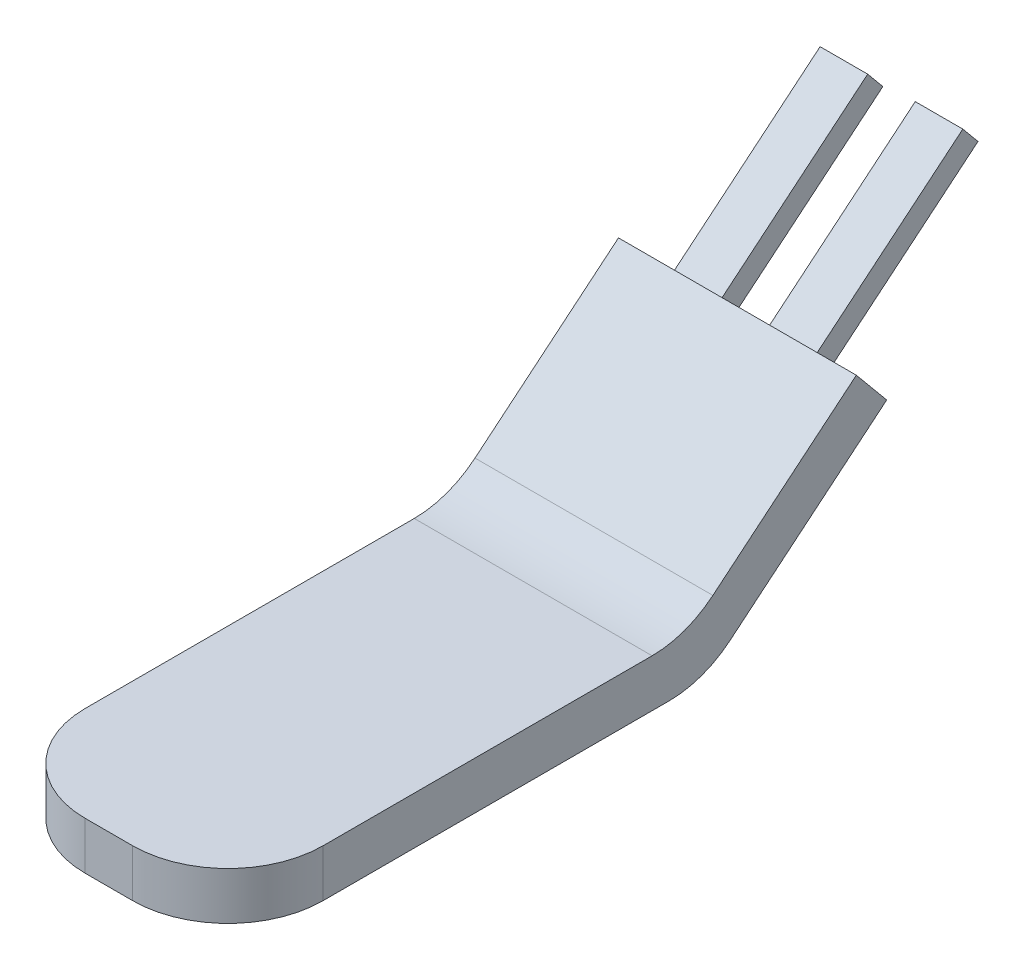
ISO-10303-21;
HEADER;
FILE_DESCRIPTION(('STEP AP214'),'2;1');
FILE_NAME('part.step','',(''),(''),'','','');
FILE_SCHEMA(('AUTOMOTIVE_DESIGN { 1 0 10303 214 1 1 1 1 }'));
ENDSEC;
DATA;
#1=APPLICATION_CONTEXT('core data for automotive mechanical design processes');
#2=APPLICATION_PROTOCOL_DEFINITION('international standard','automotive_design',2000,#1);
#3=PRODUCT_CONTEXT('',#1,'mechanical');
#4=PRODUCT('Part','Part','',(#3));
#5=PRODUCT_RELATED_PRODUCT_CATEGORY('part','',(#4));
#6=PRODUCT_DEFINITION_FORMATION('','',#4);
#7=PRODUCT_DEFINITION_CONTEXT('part definition',#1,'design');
#8=PRODUCT_DEFINITION('design','',#6,#7);
#9=PRODUCT_DEFINITION_SHAPE('','',#8);
#10=(LENGTH_UNIT() NAMED_UNIT(*) SI_UNIT(.MILLI.,.METRE.));
#11=(NAMED_UNIT(*) PLANE_ANGLE_UNIT() SI_UNIT($,.RADIAN.));
#12=(NAMED_UNIT(*) SI_UNIT($,.STERADIAN.) SOLID_ANGLE_UNIT());
#13=UNCERTAINTY_MEASURE_WITH_UNIT(LENGTH_MEASURE(1.E-05),#10,'distance_accuracy_value','');
#14=(GEOMETRIC_REPRESENTATION_CONTEXT(3) GLOBAL_UNCERTAINTY_ASSIGNED_CONTEXT((#13)) GLOBAL_UNIT_ASSIGNED_CONTEXT((#10,
#11,#12)) REPRESENTATION_CONTEXT('',''));
#15=CARTESIAN_POINT('',(0.,0.,0.));
#16=DIRECTION('',(0.,0.,1.));
#17=DIRECTION('',(1.,0.,0.));
#18=AXIS2_PLACEMENT_3D('',#15,#16,#17);
#19=CARTESIAN_POINT('',(2.5,1.59603458728937,-6.92423324890099));
#20=DIRECTION('',(0.,-0.63841383491575,0.769693299560393));
#21=DIRECTION('',(0.,-0.769693299560394,-0.63841383491575));
#22=AXIS2_PLACEMENT_3D('',#19,#20,#21);
#23=PLANE('',#22);
#24=DIRECTION('',(0.,-0.769693299560392,-0.638413834915752));
#25=VECTOR('',#24,1.);
#26=CARTESIAN_POINT('',(2.,1.69224624973443,-6.84443151953653));
#27=LINE('',#26,#25);
#28=CARTESIAN_POINT('',(2.,1.88466957462453,-6.68482806080759));
#29=VERTEX_POINT('',#28);
#30=CARTESIAN_POINT('',(2.,1.69224624973442,-6.84443151953652));
#31=VERTEX_POINT('',#30);
#32=EDGE_CURVE('E178',#29,#31,#27,.T.);
#33=ORIENTED_EDGE('',*,*,#32,.F.);
#34=DIRECTION('',(1.,0.,0.));
#35=VECTOR('',#34,1.);
#36=CARTESIAN_POINT('',(1.5,1.88466957462453,-6.68482806080759));
#37=LINE('',#36,#35);
#38=CARTESIAN_POINT('',(1.5,1.88466957462452,-6.68482806080758));
#39=VERTEX_POINT('',#38);
#40=EDGE_CURVE('E191',#39,#29,#37,.T.);
#41=ORIENTED_EDGE('',*,*,#40,.F.);
#42=DIRECTION('',(0.,0.769693299560392,0.638413834915752));
#43=VECTOR('',#42,1.);
#44=CARTESIAN_POINT('',(1.5,1.69224624973443,-6.84443151953653));
#45=LINE('',#44,#43);
#46=CARTESIAN_POINT('',(1.5,1.69224624973443,-6.84443151953651));
#47=VERTEX_POINT('',#46);
#48=EDGE_CURVE('E200',#47,#39,#45,.T.);
#49=ORIENTED_EDGE('',*,*,#48,.F.);
#50=DIRECTION('',(-1.,0.,0.));
#51=VECTOR('',#50,1.);
#52=CARTESIAN_POINT('',(1.5,1.69224624973443,-6.84443151953653));
#53=LINE('',#52,#51);
#54=EDGE_CURVE('E181',#31,#47,#53,.T.);
#55=ORIENTED_EDGE('',*,*,#54,.F.);
#56=EDGE_LOOP('',(#33,#41,#49,#55));
#57=FACE_BOUND('',#56,.T.);
#58=DIRECTION('',(0.,0.769693299560393,0.63841383491575));
#59=VECTOR('',#58,1.);
#60=CARTESIAN_POINT('',(0.,1.59603458728937,-6.92423324890099));
#61=LINE('',#60,#59);
#62=CARTESIAN_POINT('',(0.,1.59603458728937,-6.92423324890099));
#63=VERTEX_POINT('',#62);
#64=CARTESIAN_POINT('',(0.,1.98088123706957,-6.60502633144311));
#65=VERTEX_POINT('',#64);
#66=EDGE_CURVE('E235',#63,#65,#61,.T.);
#67=ORIENTED_EDGE('',*,*,#66,.T.);
#68=DIRECTION('',(-1.,0.,0.));
#69=VECTOR('',#68,1.);
#70=CARTESIAN_POINT('',(2.5,1.98088123706957,-6.60502633144311));
#71=LINE('',#70,#69);
#72=CARTESIAN_POINT('',(2.5,1.98088123706957,-6.60502633144311));
#73=VERTEX_POINT('',#72);
#74=EDGE_CURVE('E243',#73,#65,#71,.T.);
#75=ORIENTED_EDGE('',*,*,#74,.F.);
#76=DIRECTION('',(0.,0.769693299560393,0.63841383491575));
#77=VECTOR('',#76,1.);
#78=CARTESIAN_POINT('',(2.5,1.59603458728937,-6.92423324890099));
#79=LINE('',#78,#77);
#80=CARTESIAN_POINT('',(2.5,1.59603458728937,-6.92423324890099));
#81=VERTEX_POINT('',#80);
#82=EDGE_CURVE('E223',#81,#73,#79,.T.);
#83=ORIENTED_EDGE('',*,*,#82,.F.);
#84=DIRECTION('',(-1.,0.,0.));
#85=VECTOR('',#84,1.);
#86=CARTESIAN_POINT('',(2.5,1.59603458728937,-6.92423324890099));
#87=LINE('',#86,#85);
#88=EDGE_CURVE('E246',#81,#63,#87,.T.);
#89=ORIENTED_EDGE('',*,*,#88,.T.);
#90=EDGE_LOOP('',(#67,#75,#83,#89));
#91=FACE_BOUND('',#90,.T.);
#92=DIRECTION('',(0.,0.769693299560392,0.638413834915751));
#93=VECTOR('',#92,1.);
#94=CARTESIAN_POINT('',(0.500000000000001,1.69224624973443,-6.84443151953653));
#95=LINE('',#94,#93);
#96=CARTESIAN_POINT('',(0.500000000000001,1.69224624973443,-6.84443151953653));
#97=VERTEX_POINT('',#96);
#98=CARTESIAN_POINT('',(0.500000000000001,1.88466957462452,-6.68482806080758));
#99=VERTEX_POINT('',#98);
#100=EDGE_CURVE('E177',#97,#99,#95,.T.);
#101=ORIENTED_EDGE('',*,*,#100,.F.);
#102=DIRECTION('',(-1.,0.,0.));
#103=VECTOR('',#102,1.);
#104=CARTESIAN_POINT('',(1.,1.69224624973443,-6.84443151953653));
#105=LINE('',#104,#103);
#106=CARTESIAN_POINT('',(1.,1.69224624973442,-6.84443151953652));
#107=VERTEX_POINT('',#106);
#108=EDGE_CURVE('E174',#107,#97,#105,.T.);
#109=ORIENTED_EDGE('',*,*,#108,.F.);
#110=DIRECTION('',(0.,-0.769693299560393,-0.638413834915751));
#111=VECTOR('',#110,1.);
#112=CARTESIAN_POINT('',(1.,1.69224624973443,-6.84443151953653));
#113=LINE('',#112,#111);
#114=CARTESIAN_POINT('',(1.,1.88466957462451,-6.68482806080759));
#115=VERTEX_POINT('',#114);
#116=EDGE_CURVE('E53',#115,#107,#113,.T.);
#117=ORIENTED_EDGE('',*,*,#116,.F.);
#118=DIRECTION('',(1.,0.,0.));
#119=VECTOR('',#118,1.);
#120=CARTESIAN_POINT('',(1.,1.88466957462453,-6.68482806080759));
#121=LINE('',#120,#119);
#122=EDGE_CURVE('E48',#99,#115,#121,.T.);
#123=ORIENTED_EDGE('',*,*,#122,.F.);
#124=EDGE_LOOP('',(#101,#109,#117,#123));
#125=FACE_BOUND('',#124,.T.);
#126=ADVANCED_FACE('F33',(#57,#91,#125),#23,.F.);
#127=CARTESIAN_POINT('',(2.5,0.499999999999999,0.));
#128=DIRECTION('',(0.,0.,-1.));
#129=DIRECTION('',(0.,1.,0.));
#130=AXIS2_PLACEMENT_3D('',#127,#128,#129);
#131=PLANE('',#130);
#132=DIRECTION('',(-1.,0.,0.));
#133=VECTOR('',#132,1.);
#134=CARTESIAN_POINT('',(2.5,0.,0.));
#135=LINE('',#134,#133);
#136=CARTESIAN_POINT('',(1.5,0.,0.));
#137=VERTEX_POINT('',#136);
#138=CARTESIAN_POINT('',(1.,0.,0.));
#139=VERTEX_POINT('',#138);
#140=EDGE_CURVE('E249',#137,#139,#135,.T.);
#141=ORIENTED_EDGE('',*,*,#140,.F.);
#142=DIRECTION('',(0.,-1.,0.));
#143=VECTOR('',#142,1.);
#144=CARTESIAN_POINT('',(1.5,0.499999999999999,0.));
#145=LINE('',#144,#143);
#146=CARTESIAN_POINT('',(1.5,0.499999999999999,0.));
#147=VERTEX_POINT('',#146);
#148=EDGE_CURVE('E262',#137,#147,#145,.F.);
#149=ORIENTED_EDGE('',*,*,#148,.T.);
#150=DIRECTION('',(-1.,0.,0.));
#151=VECTOR('',#150,1.);
#152=CARTESIAN_POINT('',(2.5,0.499999999999999,0.));
#153=LINE('',#152,#151);
#154=CARTESIAN_POINT('',(1.,0.499999999999999,0.));
#155=VERTEX_POINT('',#154);
#156=EDGE_CURVE('E230',#147,#155,#153,.T.);
#157=ORIENTED_EDGE('',*,*,#156,.T.);
#158=DIRECTION('',(0.,-1.,0.));
#159=VECTOR('',#158,1.);
#160=CARTESIAN_POINT('',(1.,0.499999999999999,0.));
#161=LINE('',#160,#159);
#162=EDGE_CURVE('E259',#155,#139,#161,.T.);
#163=ORIENTED_EDGE('',*,*,#162,.T.);
#164=EDGE_LOOP('',(#141,#149,#157,#163));
#165=FACE_BOUND('',#164,.T.);
#166=ADVANCED_FACE('F332',(#165),#131,.F.);
#167=CARTESIAN_POINT('',(2.5,0.,0.));
#168=DIRECTION('',(0.,1.,0.));
#169=DIRECTION('',(0.,0.,1.));
#170=AXIS2_PLACEMENT_3D('',#167,#168,#169);
#171=PLANE('',#170);
#172=DIRECTION('',(0.,0.,-1.));
#173=VECTOR('',#172,1.);
#174=CARTESIAN_POINT('',(0.,0.,0.));
#175=LINE('',#174,#173);
#176=CARTESIAN_POINT('',(0.,0.,-1.));
#177=VERTEX_POINT('',#176);
#178=CARTESIAN_POINT('',(0.,0.,-4.63925170814947));
#179=VERTEX_POINT('',#178);
#180=EDGE_CURVE('E216',#177,#179,#175,.T.);
#181=ORIENTED_EDGE('',*,*,#180,.T.);
#182=DIRECTION('',(-1.,0.,0.));
#183=VECTOR('',#182,1.);
#184=CARTESIAN_POINT('',(2.5,0.,-4.63925170814947));
#185=LINE('',#184,#183);
#186=CARTESIAN_POINT('',(2.5,0.,-4.63925170814947));
#187=VERTEX_POINT('',#186);
#188=EDGE_CURVE('E277',#179,#187,#185,.F.);
#189=ORIENTED_EDGE('',*,*,#188,.T.);
#190=DIRECTION('',(0.,0.,-1.));
#191=VECTOR('',#190,1.);
#192=CARTESIAN_POINT('',(2.5,0.,0.));
#193=LINE('',#192,#191);
#194=CARTESIAN_POINT('',(2.5,0.,-1.));
#195=VERTEX_POINT('',#194);
#196=EDGE_CURVE('E217',#195,#187,#193,.T.);
#197=ORIENTED_EDGE('',*,*,#196,.F.);
#198=CARTESIAN_POINT('',(1.5,0.,-1.));
#199=DIRECTION('',(0.,1.,0.));
#200=DIRECTION('',(0.,0.,1.));
#201=AXIS2_PLACEMENT_3D('',#198,#199,#200);
#202=CIRCLE('',#201,1.);
#203=EDGE_CURVE('E257',#195,#137,#202,.F.);
#204=ORIENTED_EDGE('',*,*,#203,.T.);
#205=ORIENTED_EDGE('',*,*,#140,.T.);
#206=CARTESIAN_POINT('',(1.,0.,-1.));
#207=DIRECTION('',(0.,1.,0.));
#208=DIRECTION('',(0.,0.,1.));
#209=AXIS2_PLACEMENT_3D('',#206,#207,#208);
#210=CIRCLE('',#209,1.);
#211=EDGE_CURVE('E255',#139,#177,#210,.F.);
#212=ORIENTED_EDGE('',*,*,#211,.T.);
#213=EDGE_LOOP('',(#181,#189,#197,#204,#205,#212));
#214=FACE_BOUND('',#213,.T.);
#215=ADVANCED_FACE('F313',(#214),#171,.F.);
#216=CARTESIAN_POINT('',(2.5,0.,-5.));
#217=DIRECTION('',(0.,0.769693299560395,0.638413834915748));
#218=DIRECTION('',(0.,-0.638413834915748,0.769693299560395));
#219=AXIS2_PLACEMENT_3D('',#216,#217,#218);
#220=PLANE('',#219);
#221=DIRECTION('',(0.,0.638413834915748,-0.769693299560395));
#222=VECTOR('',#221,1.);
#223=CARTESIAN_POINT('',(2.5,0.,-5.));
#224=LINE('',#223,#222);
#225=CARTESIAN_POINT('',(2.5,0.230306700439605,-5.27766554306521));
#226=VERTEX_POINT('',#225);
#227=EDGE_CURVE('E220',#226,#81,#224,.T.);
#228=ORIENTED_EDGE('',*,*,#227,.F.);
#229=DIRECTION('',(-1.,0.,0.));
#230=VECTOR('',#229,1.);
#231=CARTESIAN_POINT('',(2.5,0.230306700439605,-5.27766554306521));
#232=LINE('',#231,#230);
#233=CARTESIAN_POINT('',(0.,0.230306700439605,-5.27766554306521));
#234=VERTEX_POINT('',#233);
#235=EDGE_CURVE('E272',#226,#234,#232,.T.);
#236=ORIENTED_EDGE('',*,*,#235,.T.);
#237=DIRECTION('',(0.,0.638413834915748,-0.769693299560395));
#238=VECTOR('',#237,1.);
#239=CARTESIAN_POINT('',(0.,0.,-5.));
#240=LINE('',#239,#238);
#241=EDGE_CURVE('E233',#234,#63,#240,.T.);
#242=ORIENTED_EDGE('',*,*,#241,.T.);
#243=ORIENTED_EDGE('',*,*,#88,.F.);
#244=EDGE_LOOP('',(#228,#236,#242,#243));
#245=FACE_BOUND('',#244,.T.);
#246=ADVANCED_FACE('F323',(#245),#220,.F.);
#247=CARTESIAN_POINT('',(2.5,1.98088123706957,-6.60502633144311));
#248=DIRECTION('',(0.,-0.769693299560395,-0.638413834915748));
#249=DIRECTION('',(0.,0.638413834915748,-0.769693299560395));
#250=AXIS2_PLACEMENT_3D('',#247,#248,#249);
#251=PLANE('',#250);
#252=DIRECTION('',(0.,-0.638413834915748,0.769693299560395));
#253=VECTOR('',#252,1.);
#254=CARTESIAN_POINT('',(0.,1.98088123706957,-6.60502633144311));
#255=LINE('',#254,#253);
#256=CARTESIAN_POINT('',(0.,0.730306700439605,-5.09729139713995));
#257=VERTEX_POINT('',#256);
#258=EDGE_CURVE('E237',#65,#257,#255,.T.);
#259=ORIENTED_EDGE('',*,*,#258,.T.);
#260=DIRECTION('',(-1.,0.,0.));
#261=VECTOR('',#260,1.);
#262=CARTESIAN_POINT('',(2.5,0.730306700439605,-5.09729139713995));
#263=LINE('',#262,#261);
#264=CARTESIAN_POINT('',(2.5,0.730306700439605,-5.09729139713995));
#265=VERTEX_POINT('',#264);
#266=EDGE_CURVE('E284',#257,#265,#263,.F.);
#267=ORIENTED_EDGE('',*,*,#266,.T.);
#268=DIRECTION('',(0.,-0.638413834915748,0.769693299560395));
#269=VECTOR('',#268,1.);
#270=CARTESIAN_POINT('',(2.5,1.98088123706957,-6.60502633144311));
#271=LINE('',#270,#269);
#272=EDGE_CURVE('E225',#73,#265,#271,.T.);
#273=ORIENTED_EDGE('',*,*,#272,.F.);
#274=ORIENTED_EDGE('',*,*,#74,.T.);
#275=EDGE_LOOP('',(#259,#267,#273,#274));
#276=FACE_BOUND('',#275,.T.);
#277=ADVANCED_FACE('F295',(#276),#251,.F.);
#278=CARTESIAN_POINT('',(2.5,0.5,-4.81962585407473));
#279=DIRECTION('',(0.,-1.,0.));
#280=DIRECTION('',(0.,0.,-1.));
#281=AXIS2_PLACEMENT_3D('',#278,#279,#280);
#282=PLANE('',#281);
#283=DIRECTION('',(0.,0.,1.));
#284=VECTOR('',#283,1.);
#285=CARTESIAN_POINT('',(2.5,0.5,-4.81962585407473));
#286=LINE('',#285,#284);
#287=CARTESIAN_POINT('',(2.5,0.5,-4.4588775622242));
#288=VERTEX_POINT('',#287);
#289=CARTESIAN_POINT('',(2.5,0.499999999999999,-1.));
#290=VERTEX_POINT('',#289);
#291=EDGE_CURVE('E228',#288,#290,#286,.T.);
#292=ORIENTED_EDGE('',*,*,#291,.F.);
#293=DIRECTION('',(-1.,0.,0.));
#294=VECTOR('',#293,1.);
#295=CARTESIAN_POINT('',(0.,0.5,-4.4588775622242));
#296=LINE('',#295,#294);
#297=CARTESIAN_POINT('',(0.,0.5,-4.4588775622242));
#298=VERTEX_POINT('',#297);
#299=EDGE_CURVE('E281',#288,#298,#296,.T.);
#300=ORIENTED_EDGE('',*,*,#299,.T.);
#301=DIRECTION('',(0.,0.,1.));
#302=VECTOR('',#301,1.);
#303=CARTESIAN_POINT('',(0.,0.5,-4.81962585407473));
#304=LINE('',#303,#302);
#305=CARTESIAN_POINT('',(0.,0.499999999999999,-1.));
#306=VERTEX_POINT('',#305);
#307=EDGE_CURVE('E221',#298,#306,#304,.T.);
#308=ORIENTED_EDGE('',*,*,#307,.T.);
#309=CARTESIAN_POINT('',(1.,0.499999999999999,-1.));
#310=DIRECTION('',(0.,-1.,0.));
#311=DIRECTION('',(0.,0.,-1.));
#312=AXIS2_PLACEMENT_3D('',#309,#310,#311);
#313=CIRCLE('',#312,1.);
#314=EDGE_CURVE('E264',#306,#155,#313,.F.);
#315=ORIENTED_EDGE('',*,*,#314,.T.);
#316=ORIENTED_EDGE('',*,*,#156,.F.);
#317=CARTESIAN_POINT('',(1.5,0.499999999999999,-1.));
#318=DIRECTION('',(0.,-1.,0.));
#319=DIRECTION('',(0.,0.,-1.));
#320=AXIS2_PLACEMENT_3D('',#317,#318,#319);
#321=CIRCLE('',#320,1.);
#322=EDGE_CURVE('E266',#147,#290,#321,.F.);
#323=ORIENTED_EDGE('',*,*,#322,.T.);
#324=EDGE_LOOP('',(#292,#300,#308,#315,#316,#323));
#325=FACE_BOUND('',#324,.T.);
#326=ADVANCED_FACE('F303',(#325),#282,.F.);
#327=CARTESIAN_POINT('',(2.5,0.,0.));
#328=DIRECTION('',(1.,0.,0.));
#329=DIRECTION('',(0.,0.,-1.));
#330=AXIS2_PLACEMENT_3D('',#327,#328,#329);
#331=PLANE('',#330);
#332=ORIENTED_EDGE('',*,*,#196,.T.);
#333=CARTESIAN_POINT('',(2.5,1.,-4.63925170814947));
#334=DIRECTION('',(1.,0.,0.));
#335=DIRECTION('',(0.,0.,-1.));
#336=AXIS2_PLACEMENT_3D('',#333,#334,#335);
#337=CIRCLE('',#336,1.);
#338=EDGE_CURVE('E279',#187,#226,#337,.T.);
#339=ORIENTED_EDGE('',*,*,#338,.T.);
#340=ORIENTED_EDGE('',*,*,#227,.T.);
#341=ORIENTED_EDGE('',*,*,#82,.T.);
#342=ORIENTED_EDGE('',*,*,#272,.T.);
#343=CARTESIAN_POINT('',(2.5,1.5,-4.4588775622242));
#344=DIRECTION('',(1.,0.,0.));
#345=DIRECTION('',(0.,0.,-1.));
#346=AXIS2_PLACEMENT_3D('',#343,#344,#345);
#347=CIRCLE('',#346,1.);
#348=EDGE_CURVE('E11',#265,#288,#347,.F.);
#349=ORIENTED_EDGE('',*,*,#348,.T.);
#350=ORIENTED_EDGE('',*,*,#291,.T.);
#351=DIRECTION('',(0.,-1.,0.));
#352=VECTOR('',#351,1.);
#353=CARTESIAN_POINT('',(2.5,0.,-1.));
#354=LINE('',#353,#352);
#355=EDGE_CURVE('E252',#290,#195,#354,.T.);
#356=ORIENTED_EDGE('',*,*,#355,.T.);
#357=EDGE_LOOP('',(#332,#339,#340,#341,#342,#349,#350,#356));
#358=FACE_BOUND('',#357,.T.);
#359=ADVANCED_FACE('F301',(#358),#331,.T.);
#360=CARTESIAN_POINT('',(0.,0.,0.));
#361=DIRECTION('',(1.,0.,0.));
#362=DIRECTION('',(0.,0.,-1.));
#363=AXIS2_PLACEMENT_3D('',#360,#361,#362);
#364=PLANE('',#363);
#365=ORIENTED_EDGE('',*,*,#241,.F.);
#366=CARTESIAN_POINT('',(0.,1.,-4.63925170814947));
#367=DIRECTION('',(1.,0.,0.));
#368=DIRECTION('',(0.,0.,-1.));
#369=AXIS2_PLACEMENT_3D('',#366,#367,#368);
#370=CIRCLE('',#369,1.);
#371=EDGE_CURVE('E275',#234,#179,#370,.F.);
#372=ORIENTED_EDGE('',*,*,#371,.T.);
#373=ORIENTED_EDGE('',*,*,#180,.F.);
#374=DIRECTION('',(0.,-1.,0.));
#375=VECTOR('',#374,1.);
#376=CARTESIAN_POINT('',(0.,0.,-1.));
#377=LINE('',#376,#375);
#378=EDGE_CURVE('E269',#177,#306,#377,.F.);
#379=ORIENTED_EDGE('',*,*,#378,.T.);
#380=ORIENTED_EDGE('',*,*,#307,.F.);
#381=CARTESIAN_POINT('',(0.,1.5,-4.4588775622242));
#382=DIRECTION('',(1.,0.,0.));
#383=DIRECTION('',(0.,0.,-1.));
#384=AXIS2_PLACEMENT_3D('',#381,#382,#383);
#385=CIRCLE('',#384,1.);
#386=EDGE_CURVE('E41',#298,#257,#385,.T.);
#387=ORIENTED_EDGE('',*,*,#386,.T.);
#388=ORIENTED_EDGE('',*,*,#258,.F.);
#389=ORIENTED_EDGE('',*,*,#66,.F.);
#390=EDGE_LOOP('',(#365,#372,#373,#379,#380,#387,#388,#389));
#391=FACE_BOUND('',#390,.T.);
#392=ADVANCED_FACE('F289',(#391),#364,.F.);
#393=CARTESIAN_POINT('',(1.5,0.,-1.));
#394=DIRECTION('',(0.,1.,0.));
#395=DIRECTION('',(0.,0.,1.));
#396=AXIS2_PLACEMENT_3D('',#393,#394,#395);
#397=CYLINDRICAL_SURFACE('',#396,1.);
#398=ORIENTED_EDGE('',*,*,#322,.F.);
#399=ORIENTED_EDGE('',*,*,#148,.F.);
#400=ORIENTED_EDGE('',*,*,#203,.F.);
#401=ORIENTED_EDGE('',*,*,#355,.F.);
#402=EDGE_LOOP('',(#398,#399,#400,#401));
#403=FACE_BOUND('',#402,.T.);
#404=ADVANCED_FACE('F309',(#403),#397,.T.);
#405=CARTESIAN_POINT('',(1.,0.499999999999999,-1.));
#406=DIRECTION('',(0.,-1.,0.));
#407=DIRECTION('',(0.,0.,-1.));
#408=AXIS2_PLACEMENT_3D('',#405,#406,#407);
#409=CYLINDRICAL_SURFACE('',#408,1.);
#410=ORIENTED_EDGE('',*,*,#314,.F.);
#411=ORIENTED_EDGE('',*,*,#378,.F.);
#412=ORIENTED_EDGE('',*,*,#211,.F.);
#413=ORIENTED_EDGE('',*,*,#162,.F.);
#414=EDGE_LOOP('',(#410,#411,#412,#413));
#415=FACE_BOUND('',#414,.T.);
#416=ADVANCED_FACE('F329',(#415),#409,.T.);
#417=CARTESIAN_POINT('',(2.5,1.,-4.63925170814947));
#418=DIRECTION('',(-1.,0.,0.));
#419=DIRECTION('',(0.,0.,1.));
#420=AXIS2_PLACEMENT_3D('',#417,#418,#419);
#421=CYLINDRICAL_SURFACE('',#420,1.);
#422=ORIENTED_EDGE('',*,*,#338,.F.);
#423=ORIENTED_EDGE('',*,*,#188,.F.);
#424=ORIENTED_EDGE('',*,*,#371,.F.);
#425=ORIENTED_EDGE('',*,*,#235,.F.);
#426=EDGE_LOOP('',(#422,#423,#424,#425));
#427=FACE_BOUND('',#426,.T.);
#428=ADVANCED_FACE('F318',(#427),#421,.T.);
#429=CARTESIAN_POINT('',(2.5,1.5,-4.4588775622242));
#430=DIRECTION('',(1.,0.,0.));
#431=DIRECTION('',(0.,0.,-1.));
#432=AXIS2_PLACEMENT_3D('',#429,#430,#431);
#433=CYLINDRICAL_SURFACE('',#432,1.);
#434=ORIENTED_EDGE('',*,*,#348,.F.);
#435=ORIENTED_EDGE('',*,*,#266,.F.);
#436=ORIENTED_EDGE('',*,*,#386,.F.);
#437=ORIENTED_EDGE('',*,*,#299,.F.);
#438=EDGE_LOOP('',(#434,#435,#436,#437));
#439=FACE_BOUND('',#438,.T.);
#440=ADVANCED_FACE('F35',(#439),#433,.F.);
#441=CARTESIAN_POINT('',(2.,2.96907391956593,-8.38381811865731));
#442=DIRECTION('',(-1.,0.,0.));
#443=DIRECTION('',(0.,0.,1.));
#444=AXIS2_PLACEMENT_3D('',#441,#442,#443);
#445=PLANE('',#444);
#446=ORIENTED_EDGE('',*,*,#32,.T.);
#447=DIRECTION('',(0.,-0.638413834915752,0.769693299560392));
#448=VECTOR('',#447,1.);
#449=CARTESIAN_POINT('',(2.,2.96907391956593,-8.38381811865731));
#450=LINE('',#449,#448);
#451=CARTESIAN_POINT('',(2.,2.96907391956593,-8.38381811865731));
#452=VERTEX_POINT('',#451);
#453=EDGE_CURVE('E213',#452,#31,#450,.T.);
#454=ORIENTED_EDGE('',*,*,#453,.F.);
#455=DIRECTION('',(0.,-0.769693299560392,-0.638413834915752));
#456=VECTOR('',#455,1.);
#457=CARTESIAN_POINT('',(2.,2.96907391956593,-8.38381811865731));
#458=LINE('',#457,#456);
#459=CARTESIAN_POINT('',(2.,3.16149724445603,-8.22421465992837));
#460=VERTEX_POINT('',#459);
#461=EDGE_CURVE('E187',#460,#452,#458,.T.);
#462=ORIENTED_EDGE('',*,*,#461,.F.);
#463=DIRECTION('',(0.,-0.638413834915752,0.769693299560392));
#464=VECTOR('',#463,1.);
#465=CARTESIAN_POINT('',(2.,3.16149724445603,-8.22421465992837));
#466=LINE('',#465,#464);
#467=EDGE_CURVE('E196',#460,#29,#466,.T.);
#468=ORIENTED_EDGE('',*,*,#467,.T.);
#469=EDGE_LOOP('',(#446,#454,#462,#468));
#470=FACE_BOUND('',#469,.T.);
#471=ADVANCED_FACE('F351',(#470),#445,.F.);
#472=CARTESIAN_POINT('',(1.5,2.96907391956593,-8.38381811865731));
#473=DIRECTION('',(0.,0.769693299560392,0.638413834915752));
#474=DIRECTION('',(0.,-0.638413834915752,0.769693299560392));
#475=AXIS2_PLACEMENT_3D('',#472,#473,#474);
#476=PLANE('',#475);
#477=ORIENTED_EDGE('',*,*,#54,.T.);
#478=DIRECTION('',(0.,-0.638413834915752,0.769693299560392));
#479=VECTOR('',#478,1.);
#480=CARTESIAN_POINT('',(1.5,2.96907391956593,-8.38381811865731));
#481=LINE('',#480,#479);
#482=CARTESIAN_POINT('',(1.5,2.96907391956593,-8.38381811865731));
#483=VERTEX_POINT('',#482);
#484=EDGE_CURVE('E210',#483,#47,#481,.T.);
#485=ORIENTED_EDGE('',*,*,#484,.F.);
#486=DIRECTION('',(-1.,0.,0.));
#487=VECTOR('',#486,1.);
#488=CARTESIAN_POINT('',(1.5,2.96907391956593,-8.38381811865731));
#489=LINE('',#488,#487);
#490=EDGE_CURVE('E190',#452,#483,#489,.T.);
#491=ORIENTED_EDGE('',*,*,#490,.F.);
#492=ORIENTED_EDGE('',*,*,#453,.T.);
#493=EDGE_LOOP('',(#477,#485,#491,#492));
#494=FACE_BOUND('',#493,.T.);
#495=ADVANCED_FACE('F355',(#494),#476,.F.);
#496=CARTESIAN_POINT('',(1.5,2.96907391956593,-8.38381811865731));
#497=DIRECTION('',(1.,0.,0.));
#498=DIRECTION('',(0.,0.,-1.));
#499=AXIS2_PLACEMENT_3D('',#496,#497,#498);
#500=PLANE('',#499);
#501=ORIENTED_EDGE('',*,*,#48,.T.);
#502=DIRECTION('',(0.,-0.638413834915752,0.769693299560392));
#503=VECTOR('',#502,1.);
#504=CARTESIAN_POINT('',(1.5,3.16149724445603,-8.22421465992837));
#505=LINE('',#504,#503);
#506=CARTESIAN_POINT('',(1.5,3.16149724445603,-8.22421465992837));
#507=VERTEX_POINT('',#506);
#508=EDGE_CURVE('E207',#507,#39,#505,.T.);
#509=ORIENTED_EDGE('',*,*,#508,.F.);
#510=DIRECTION('',(0.,0.769693299560392,0.638413834915752));
#511=VECTOR('',#510,1.);
#512=CARTESIAN_POINT('',(1.5,2.96907391956593,-8.38381811865731));
#513=LINE('',#512,#511);
#514=EDGE_CURVE('E193',#483,#507,#513,.T.);
#515=ORIENTED_EDGE('',*,*,#514,.F.);
#516=ORIENTED_EDGE('',*,*,#484,.T.);
#517=EDGE_LOOP('',(#501,#509,#515,#516));
#518=FACE_BOUND('',#517,.T.);
#519=ADVANCED_FACE('F361',(#518),#500,.F.);
#520=CARTESIAN_POINT('',(1.5,3.16149724445603,-8.22421465992837));
#521=DIRECTION('',(0.,-0.769693299560392,-0.638413834915752));
#522=DIRECTION('',(0.,0.638413834915752,-0.769693299560392));
#523=AXIS2_PLACEMENT_3D('',#520,#521,#522);
#524=PLANE('',#523);
#525=ORIENTED_EDGE('',*,*,#40,.T.);
#526=ORIENTED_EDGE('',*,*,#467,.F.);
#527=DIRECTION('',(1.,0.,0.));
#528=VECTOR('',#527,1.);
#529=CARTESIAN_POINT('',(1.5,3.16149724445603,-8.22421465992837));
#530=LINE('',#529,#528);
#531=EDGE_CURVE('E195',#507,#460,#530,.T.);
#532=ORIENTED_EDGE('',*,*,#531,.F.);
#533=ORIENTED_EDGE('',*,*,#508,.T.);
#534=EDGE_LOOP('',(#525,#526,#532,#533));
#535=FACE_BOUND('',#534,.T.);
#536=ADVANCED_FACE('F454',(#535),#524,.F.);
#537=CARTESIAN_POINT('',(0.,5.32977651252743,-6.42575872496259));
#538=DIRECTION('',(0.,0.638413834915752,-0.769693299560392));
#539=DIRECTION('',(0.,0.769693299560392,0.638413834915752));
#540=AXIS2_PLACEMENT_3D('',#537,#538,#539);
#541=PLANE('',#540);
#542=ORIENTED_EDGE('',*,*,#461,.T.);
#543=ORIENTED_EDGE('',*,*,#490,.T.);
#544=ORIENTED_EDGE('',*,*,#514,.T.);
#545=ORIENTED_EDGE('',*,*,#531,.T.);
#546=EDGE_LOOP('',(#542,#543,#544,#545));
#547=FACE_BOUND('',#546,.T.);
#548=ADVANCED_FACE('F462',(#547),#541,.T.);
#549=CARTESIAN_POINT('',(0.500000000000001,2.96907391956593,-8.38381811865731));
#550=DIRECTION('',(1.,0.,0.));
#551=DIRECTION('',(0.,0.,-1.));
#552=AXIS2_PLACEMENT_3D('',#549,#550,#551);
#553=PLANE('',#552);
#554=ORIENTED_EDGE('',*,*,#100,.T.);
#555=DIRECTION('',(0.,-0.638413834915752,0.769693299560392));
#556=VECTOR('',#555,1.);
#557=CARTESIAN_POINT('',(0.500000000000001,3.16149724445603,-8.22421465992837));
#558=LINE('',#557,#556);
#559=CARTESIAN_POINT('',(0.500000000000001,3.16149724445603,-8.22421465992837));
#560=VERTEX_POINT('',#559);
#561=EDGE_CURVE('E158',#560,#99,#558,.T.);
#562=ORIENTED_EDGE('',*,*,#561,.F.);
#563=DIRECTION('',(0.,0.769693299560392,0.638413834915751));
#564=VECTOR('',#563,1.);
#565=CARTESIAN_POINT('',(0.500000000000001,2.96907391956593,-8.38381811865731));
#566=LINE('',#565,#564);
#567=CARTESIAN_POINT('',(0.500000000000001,2.96907391956593,-8.38381811865731));
#568=VERTEX_POINT('',#567);
#569=EDGE_CURVE('E165',#568,#560,#566,.T.);
#570=ORIENTED_EDGE('',*,*,#569,.F.);
#571=DIRECTION('',(0.,-0.638413834915752,0.769693299560392));
#572=VECTOR('',#571,1.);
#573=CARTESIAN_POINT('',(0.500000000000001,2.96907391956593,-8.38381811865731));
#574=LINE('',#573,#572);
#575=EDGE_CURVE('E523',#568,#97,#574,.T.);
#576=ORIENTED_EDGE('',*,*,#575,.T.);
#577=EDGE_LOOP('',(#554,#562,#570,#576));
#578=FACE_BOUND('',#577,.T.);
#579=ADVANCED_FACE('F176',(#578),#553,.F.);
#580=CARTESIAN_POINT('',(1.,3.16149724445603,-8.22421465992837));
#581=DIRECTION('',(0.,-0.769693299560392,-0.638413834915752));
#582=DIRECTION('',(0.,0.638413834915752,-0.769693299560392));
#583=AXIS2_PLACEMENT_3D('',#580,#581,#582);
#584=PLANE('',#583);
#585=ORIENTED_EDGE('',*,*,#122,.T.);
#586=DIRECTION('',(0.,-0.638413834915752,0.769693299560392));
#587=VECTOR('',#586,1.);
#588=CARTESIAN_POINT('',(1.,3.16149724445603,-8.22421465992837));
#589=LINE('',#588,#587);
#590=CARTESIAN_POINT('',(1.,3.16149724445603,-8.22421465992837));
#591=VERTEX_POINT('',#590);
#592=EDGE_CURVE('E161',#591,#115,#589,.T.);
#593=ORIENTED_EDGE('',*,*,#592,.F.);
#594=DIRECTION('',(1.,0.,0.));
#595=VECTOR('',#594,1.);
#596=CARTESIAN_POINT('',(1.,3.16149724445603,-8.22421465992837));
#597=LINE('',#596,#595);
#598=EDGE_CURVE('E154',#560,#591,#597,.T.);
#599=ORIENTED_EDGE('',*,*,#598,.F.);
#600=ORIENTED_EDGE('',*,*,#561,.T.);
#601=EDGE_LOOP('',(#585,#593,#599,#600));
#602=FACE_BOUND('',#601,.T.);
#603=ADVANCED_FACE('F156',(#602),#584,.F.);
#604=CARTESIAN_POINT('',(1.,2.96907391956593,-8.38381811865731));
#605=DIRECTION('',(-1.,0.,0.));
#606=DIRECTION('',(0.,0.,1.));
#607=AXIS2_PLACEMENT_3D('',#604,#605,#606);
#608=PLANE('',#607);
#609=ORIENTED_EDGE('',*,*,#116,.T.);
#610=DIRECTION('',(0.,-0.638413834915752,0.769693299560392));
#611=VECTOR('',#610,1.);
#612=CARTESIAN_POINT('',(1.,2.96907391956593,-8.38381811865731));
#613=LINE('',#612,#611);
#614=CARTESIAN_POINT('',(1.,2.96907391956593,-8.38381811865731));
#615=VERTEX_POINT('',#614);
#616=EDGE_CURVE('E183',#615,#107,#613,.T.);
#617=ORIENTED_EDGE('',*,*,#616,.F.);
#618=DIRECTION('',(0.,-0.769693299560393,-0.638413834915751));
#619=VECTOR('',#618,1.);
#620=CARTESIAN_POINT('',(1.,2.96907391956593,-8.38381811865731));
#621=LINE('',#620,#619);
#622=EDGE_CURVE('E164',#591,#615,#621,.T.);
#623=ORIENTED_EDGE('',*,*,#622,.F.);
#624=ORIENTED_EDGE('',*,*,#592,.T.);
#625=EDGE_LOOP('',(#609,#617,#623,#624));
#626=FACE_BOUND('',#625,.T.);
#627=ADVANCED_FACE('F486',(#626),#608,.F.);
#628=CARTESIAN_POINT('',(1.,2.96907391956593,-8.38381811865731));
#629=DIRECTION('',(0.,0.769693299560392,0.638413834915752));
#630=DIRECTION('',(0.,-0.638413834915752,0.769693299560392));
#631=AXIS2_PLACEMENT_3D('',#628,#629,#630);
#632=PLANE('',#631);
#633=ORIENTED_EDGE('',*,*,#108,.T.);
#634=ORIENTED_EDGE('',*,*,#575,.F.);
#635=DIRECTION('',(-1.,0.,0.));
#636=VECTOR('',#635,1.);
#637=CARTESIAN_POINT('',(1.,2.96907391956593,-8.38381811865731));
#638=LINE('',#637,#636);
#639=EDGE_CURVE('E170',#615,#568,#638,.T.);
#640=ORIENTED_EDGE('',*,*,#639,.F.);
#641=ORIENTED_EDGE('',*,*,#616,.T.);
#642=EDGE_LOOP('',(#633,#634,#640,#641));
#643=FACE_BOUND('',#642,.T.);
#644=ADVANCED_FACE('F494',(#643),#632,.F.);
#645=CARTESIAN_POINT('',(0.,5.32977651252743,-6.42575872496259));
#646=DIRECTION('',(0.,-0.638413834915751,0.769693299560392));
#647=DIRECTION('',(0.,-0.769693299560392,-0.638413834915751));
#648=AXIS2_PLACEMENT_3D('',#645,#646,#647);
#649=PLANE('',#648);
#650=ORIENTED_EDGE('',*,*,#569,.T.);
#651=ORIENTED_EDGE('',*,*,#598,.T.);
#652=ORIENTED_EDGE('',*,*,#622,.T.);
#653=ORIENTED_EDGE('',*,*,#639,.T.);
#654=EDGE_LOOP('',(#650,#651,#652,#653));
#655=FACE_BOUND('',#654,.T.);
#656=ADVANCED_FACE('F168',(#655),#649,.F.);
#657=CLOSED_SHELL('',(#126,#166,#215,#246,#277,#326,#359,#392,#404,#416,#428,#440,#471,#495,
#519,#536,#548,#579,#603,#627,#644,#656));
#658=MANIFOLD_SOLID_BREP('B2',#657);
#659=ADVANCED_BREP_SHAPE_REPRESENTATION('',(#18,#658),#14);
#660=SHAPE_DEFINITION_REPRESENTATION(#9,#659);
ENDSEC;
END-ISO-10303-21;
